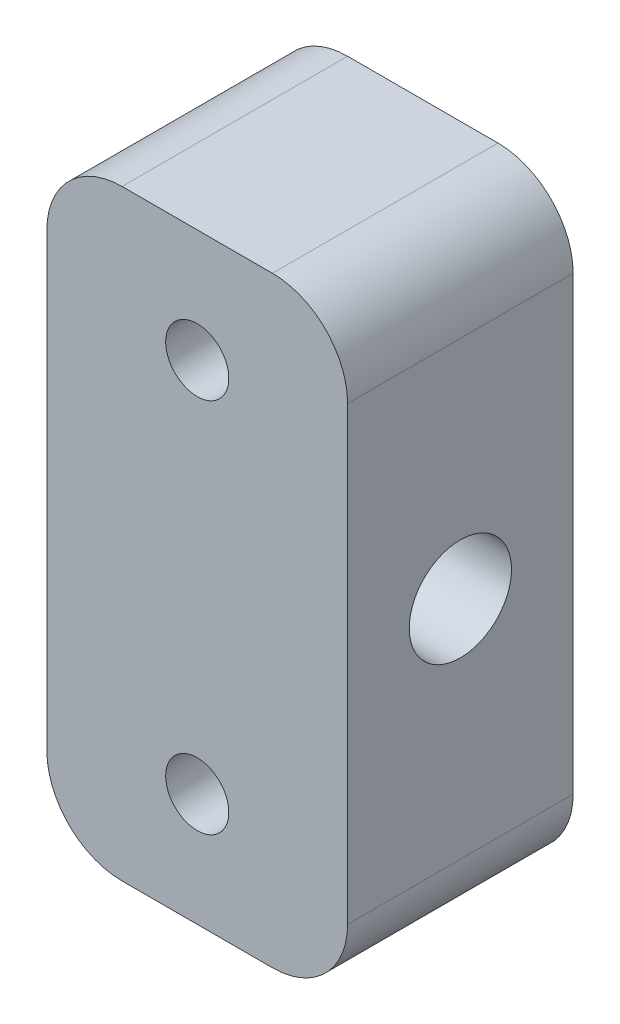
ISO-10303-21;
HEADER;
FILE_DESCRIPTION(('STEP AP214'),'2;1');
FILE_NAME('part.step','',(''),(''),'','','');
FILE_SCHEMA(('AUTOMOTIVE_DESIGN { 1 0 10303 214 1 1 1 1 }'));
ENDSEC;
DATA;
#1=APPLICATION_CONTEXT('core data for automotive mechanical design processes');
#2=APPLICATION_PROTOCOL_DEFINITION('international standard','automotive_design',2000,#1);
#3=PRODUCT_CONTEXT('',#1,'mechanical');
#4=PRODUCT('Part','Part','',(#3));
#5=PRODUCT_RELATED_PRODUCT_CATEGORY('part','',(#4));
#6=PRODUCT_DEFINITION_FORMATION('','',#4);
#7=PRODUCT_DEFINITION_CONTEXT('part definition',#1,'design');
#8=PRODUCT_DEFINITION('design','',#6,#7);
#9=PRODUCT_DEFINITION_SHAPE('','',#8);
#10=(LENGTH_UNIT() NAMED_UNIT(*) SI_UNIT(.MILLI.,.METRE.));
#11=(NAMED_UNIT(*) PLANE_ANGLE_UNIT() SI_UNIT($,.RADIAN.));
#12=(NAMED_UNIT(*) SI_UNIT($,.STERADIAN.) SOLID_ANGLE_UNIT());
#13=UNCERTAINTY_MEASURE_WITH_UNIT(LENGTH_MEASURE(1.E-05),#10,'distance_accuracy_value','');
#14=(GEOMETRIC_REPRESENTATION_CONTEXT(3) GLOBAL_UNCERTAINTY_ASSIGNED_CONTEXT((#13)) GLOBAL_UNIT_ASSIGNED_CONTEXT((#10,
#11,#12)) REPRESENTATION_CONTEXT('',''));
#15=CARTESIAN_POINT('',(0.,0.,0.));
#16=DIRECTION('',(0.,0.,1.));
#17=DIRECTION('',(1.,0.,0.));
#18=AXIS2_PLACEMENT_3D('',#15,#16,#17);
#19=CARTESIAN_POINT('',(10.,-20.,7.5));
#20=DIRECTION('',(-1.,0.,0.));
#21=DIRECTION('',(0.,0.,1.));
#22=AXIS2_PLACEMENT_3D('',#19,#20,#21);
#23=PLANE('',#22);
#24=CARTESIAN_POINT('',(10.,0.,0.));
#25=DIRECTION('',(-1.,0.,0.));
#26=DIRECTION('',(0.,0.,1.));
#27=AXIS2_PLACEMENT_3D('',#24,#25,#26);
#28=CIRCLE('',#27,3.4);
#29=CARTESIAN_POINT('',(10.,0.,3.4));
#30=VERTEX_POINT('',#29);
#31=EDGE_CURVE('E195',#30,#30,#28,.T.);
#32=ORIENTED_EDGE('',*,*,#31,.T.);
#33=EDGE_LOOP('',(#32));
#34=FACE_BOUND('',#33,.T.);
#35=DIRECTION('',(0.,1.,0.));
#36=VECTOR('',#35,1.);
#37=CARTESIAN_POINT('',(10.,-20.,7.5));
#38=LINE('',#37,#36);
#39=CARTESIAN_POINT('',(10.,-15.,7.5));
#40=VERTEX_POINT('',#39);
#41=CARTESIAN_POINT('',(10.,15.,7.5));
#42=VERTEX_POINT('',#41);
#43=EDGE_CURVE('E127',#40,#42,#38,.T.);
#44=ORIENTED_EDGE('',*,*,#43,.F.);
#45=DIRECTION('',(0.,0.,-1.));
#46=VECTOR('',#45,1.);
#47=CARTESIAN_POINT('',(10.,-15.,7.5));
#48=LINE('',#47,#46);
#49=CARTESIAN_POINT('',(10.,-15.,-7.5));
#50=VERTEX_POINT('',#49);
#51=EDGE_CURVE('E112',#40,#50,#48,.T.);
#52=ORIENTED_EDGE('',*,*,#51,.T.);
#53=DIRECTION('',(0.,1.,0.));
#54=VECTOR('',#53,1.);
#55=CARTESIAN_POINT('',(10.,-20.,-7.5));
#56=LINE('',#55,#54);
#57=CARTESIAN_POINT('',(10.,15.,-7.5));
#58=VERTEX_POINT('',#57);
#59=EDGE_CURVE('E124',#50,#58,#56,.T.);
#60=ORIENTED_EDGE('',*,*,#59,.T.);
#61=DIRECTION('',(0.,0.,-1.));
#62=VECTOR('',#61,1.);
#63=CARTESIAN_POINT('',(10.,15.,7.5));
#64=LINE('',#63,#62);
#65=EDGE_CURVE('E129',#58,#42,#64,.F.);
#66=ORIENTED_EDGE('',*,*,#65,.T.);
#67=EDGE_LOOP('',(#44,#52,#60,#66));
#68=FACE_BOUND('',#67,.T.);
#69=ADVANCED_FACE('F42',(#34,#68),#23,.F.);
#70=CARTESIAN_POINT('',(-10.,20.,7.5));
#71=DIRECTION('',(0.,-1.,0.));
#72=DIRECTION('',(0.,0.,-1.));
#73=AXIS2_PLACEMENT_3D('',#70,#71,#72);
#74=PLANE('',#73);
#75=DIRECTION('',(-1.,0.,0.));
#76=VECTOR('',#75,1.);
#77=CARTESIAN_POINT('',(-10.,20.,-7.5));
#78=LINE('',#77,#76);
#79=CARTESIAN_POINT('',(5.,20.,-7.5));
#80=VERTEX_POINT('',#79);
#81=CARTESIAN_POINT('',(-5.,20.,-7.5));
#82=VERTEX_POINT('',#81);
#83=EDGE_CURVE('E133',#80,#82,#78,.T.);
#84=ORIENTED_EDGE('',*,*,#83,.T.);
#85=DIRECTION('',(0.,0.,-1.));
#86=VECTOR('',#85,1.);
#87=CARTESIAN_POINT('',(-5.,20.,7.5));
#88=LINE('',#87,#86);
#89=CARTESIAN_POINT('',(-5.,20.,7.5));
#90=VERTEX_POINT('',#89);
#91=EDGE_CURVE('E11',#82,#90,#88,.F.);
#92=ORIENTED_EDGE('',*,*,#91,.T.);
#93=DIRECTION('',(-1.,0.,0.));
#94=VECTOR('',#93,1.);
#95=CARTESIAN_POINT('',(-10.,20.,7.5));
#96=LINE('',#95,#94);
#97=CARTESIAN_POINT('',(5.,20.,7.5));
#98=VERTEX_POINT('',#97);
#99=EDGE_CURVE('E173',#98,#90,#96,.T.);
#100=ORIENTED_EDGE('',*,*,#99,.F.);
#101=DIRECTION('',(0.,0.,-1.));
#102=VECTOR('',#101,1.);
#103=CARTESIAN_POINT('',(5.,20.,7.5));
#104=LINE('',#103,#102);
#105=EDGE_CURVE('E50',#98,#80,#104,.T.);
#106=ORIENTED_EDGE('',*,*,#105,.T.);
#107=EDGE_LOOP('',(#84,#92,#100,#106));
#108=FACE_BOUND('',#107,.T.);
#109=ADVANCED_FACE('F171',(#108),#74,.F.);
#110=CARTESIAN_POINT('',(-10.,-20.,7.5));
#111=DIRECTION('',(1.,0.,0.));
#112=DIRECTION('',(0.,0.,-1.));
#113=AXIS2_PLACEMENT_3D('',#110,#111,#112);
#114=PLANE('',#113);
#115=CARTESIAN_POINT('',(-10.,0.,0.));
#116=DIRECTION('',(-1.,0.,0.));
#117=DIRECTION('',(0.,0.,1.));
#118=AXIS2_PLACEMENT_3D('',#115,#116,#117);
#119=CIRCLE('',#118,3.39999999999999);
#120=CARTESIAN_POINT('',(-10.,0.,3.39999999999999));
#121=VERTEX_POINT('',#120);
#122=EDGE_CURVE('E198',#121,#121,#119,.T.);
#123=ORIENTED_EDGE('',*,*,#122,.F.);
#124=EDGE_LOOP('',(#123));
#125=FACE_BOUND('',#124,.T.);
#126=DIRECTION('',(0.,-1.,0.));
#127=VECTOR('',#126,1.);
#128=CARTESIAN_POINT('',(-10.,-20.,-7.5));
#129=LINE('',#128,#127);
#130=CARTESIAN_POINT('',(-10.,15.,-7.5));
#131=VERTEX_POINT('',#130);
#132=CARTESIAN_POINT('',(-10.,-15.,-7.5));
#133=VERTEX_POINT('',#132);
#134=EDGE_CURVE('E137',#131,#133,#129,.T.);
#135=ORIENTED_EDGE('',*,*,#134,.T.);
#136=DIRECTION('',(0.,0.,-1.));
#137=VECTOR('',#136,1.);
#138=CARTESIAN_POINT('',(-10.,-15.,7.5));
#139=LINE('',#138,#137);
#140=CARTESIAN_POINT('',(-10.,-15.,7.5));
#141=VERTEX_POINT('',#140);
#142=EDGE_CURVE('E57',#133,#141,#139,.F.);
#143=ORIENTED_EDGE('',*,*,#142,.T.);
#144=DIRECTION('',(0.,-1.,0.));
#145=VECTOR('',#144,1.);
#146=CARTESIAN_POINT('',(-10.,-20.,7.5));
#147=LINE('',#146,#145);
#148=CARTESIAN_POINT('',(-10.,15.,7.5));
#149=VERTEX_POINT('',#148);
#150=EDGE_CURVE('E181',#149,#141,#147,.T.);
#151=ORIENTED_EDGE('',*,*,#150,.F.);
#152=DIRECTION('',(0.,0.,-1.));
#153=VECTOR('',#152,1.);
#154=CARTESIAN_POINT('',(-10.,15.,7.5));
#155=LINE('',#154,#153);
#156=EDGE_CURVE('E164',#149,#131,#155,.T.);
#157=ORIENTED_EDGE('',*,*,#156,.T.);
#158=EDGE_LOOP('',(#135,#143,#151,#157));
#159=FACE_BOUND('',#158,.T.);
#160=ADVANCED_FACE('F180',(#125,#159),#114,.F.);
#161=CARTESIAN_POINT('',(-10.,-20.,7.5));
#162=DIRECTION('',(0.,1.,0.));
#163=DIRECTION('',(0.,0.,1.));
#164=AXIS2_PLACEMENT_3D('',#161,#162,#163);
#165=PLANE('',#164);
#166=DIRECTION('',(1.,0.,0.));
#167=VECTOR('',#166,1.);
#168=CARTESIAN_POINT('',(-10.,-20.,-7.5));
#169=LINE('',#168,#167);
#170=CARTESIAN_POINT('',(-5.,-20.,-7.5));
#171=VERTEX_POINT('',#170);
#172=CARTESIAN_POINT('',(5.,-20.,-7.5));
#173=VERTEX_POINT('',#172);
#174=EDGE_CURVE('E147',#171,#173,#169,.T.);
#175=ORIENTED_EDGE('',*,*,#174,.T.);
#176=DIRECTION('',(0.,0.,-1.));
#177=VECTOR('',#176,1.);
#178=CARTESIAN_POINT('',(5.,-20.,7.5));
#179=LINE('',#178,#177);
#180=CARTESIAN_POINT('',(5.,-20.,7.5));
#181=VERTEX_POINT('',#180);
#182=EDGE_CURVE('E113',#173,#181,#179,.F.);
#183=ORIENTED_EDGE('',*,*,#182,.T.);
#184=DIRECTION('',(1.,0.,0.));
#185=VECTOR('',#184,1.);
#186=CARTESIAN_POINT('',(-10.,-20.,7.5));
#187=LINE('',#186,#185);
#188=CARTESIAN_POINT('',(-5.,-20.,7.5));
#189=VERTEX_POINT('',#188);
#190=EDGE_CURVE('E143',#189,#181,#187,.T.);
#191=ORIENTED_EDGE('',*,*,#190,.F.);
#192=DIRECTION('',(0.,0.,-1.));
#193=VECTOR('',#192,1.);
#194=CARTESIAN_POINT('',(-5.,-20.,7.5));
#195=LINE('',#194,#193);
#196=EDGE_CURVE('E118',#189,#171,#195,.T.);
#197=ORIENTED_EDGE('',*,*,#196,.T.);
#198=EDGE_LOOP('',(#175,#183,#191,#197));
#199=FACE_BOUND('',#198,.T.);
#200=ADVANCED_FACE('F205',(#199),#165,.F.);
#201=CARTESIAN_POINT('',(0.,0.,7.5));
#202=DIRECTION('',(0.,0.,-1.));
#203=DIRECTION('',(-1.,0.,0.));
#204=AXIS2_PLACEMENT_3D('',#201,#202,#203);
#205=PLANE('',#204);
#206=CARTESIAN_POINT('',(0.,12.5,7.5));
#207=DIRECTION('',(0.,0.,-1.));
#208=DIRECTION('',(-1.,0.,0.));
#209=AXIS2_PLACEMENT_3D('',#206,#207,#208);
#210=CIRCLE('',#209,2.1);
#211=CARTESIAN_POINT('',(-2.09999999999999,12.5,7.5));
#212=VERTEX_POINT('',#211);
#213=EDGE_CURVE('E189',#212,#212,#210,.T.);
#214=ORIENTED_EDGE('',*,*,#213,.T.);
#215=EDGE_LOOP('',(#214));
#216=FACE_BOUND('',#215,.T.);
#217=CARTESIAN_POINT('',(0.,-12.5,7.5));
#218=DIRECTION('',(0.,0.,-1.));
#219=DIRECTION('',(-1.,0.,0.));
#220=AXIS2_PLACEMENT_3D('',#217,#218,#219);
#221=CIRCLE('',#220,2.1);
#222=CARTESIAN_POINT('',(-2.1,-12.5,7.5));
#223=VERTEX_POINT('',#222);
#224=EDGE_CURVE('E134',#223,#223,#221,.T.);
#225=ORIENTED_EDGE('',*,*,#224,.T.);
#226=EDGE_LOOP('',(#225));
#227=FACE_BOUND('',#226,.T.);
#228=ORIENTED_EDGE('',*,*,#190,.T.);
#229=CARTESIAN_POINT('',(5.,-15.,7.5));
#230=DIRECTION('',(0.,0.,-1.));
#231=DIRECTION('',(-1.,0.,0.));
#232=AXIS2_PLACEMENT_3D('',#229,#230,#231);
#233=CIRCLE('',#232,5.);
#234=EDGE_CURVE('E162',#181,#40,#233,.F.);
#235=ORIENTED_EDGE('',*,*,#234,.T.);
#236=ORIENTED_EDGE('',*,*,#43,.T.);
#237=CARTESIAN_POINT('',(5.,15.,7.5));
#238=DIRECTION('',(0.,0.,-1.));
#239=DIRECTION('',(-1.,0.,0.));
#240=AXIS2_PLACEMENT_3D('',#237,#238,#239);
#241=CIRCLE('',#240,5.);
#242=EDGE_CURVE('E157',#42,#98,#241,.F.);
#243=ORIENTED_EDGE('',*,*,#242,.T.);
#244=ORIENTED_EDGE('',*,*,#99,.T.);
#245=CARTESIAN_POINT('',(-5.,15.,7.5));
#246=DIRECTION('',(0.,0.,-1.));
#247=DIRECTION('',(-1.,0.,0.));
#248=AXIS2_PLACEMENT_3D('',#245,#246,#247);
#249=CIRCLE('',#248,5.);
#250=EDGE_CURVE('E64',#90,#149,#249,.F.);
#251=ORIENTED_EDGE('',*,*,#250,.T.);
#252=ORIENTED_EDGE('',*,*,#150,.T.);
#253=CARTESIAN_POINT('',(-5.,-15.,7.5));
#254=DIRECTION('',(0.,0.,-1.));
#255=DIRECTION('',(-1.,0.,0.));
#256=AXIS2_PLACEMENT_3D('',#253,#254,#255);
#257=CIRCLE('',#256,5.);
#258=EDGE_CURVE('E160',#141,#189,#257,.F.);
#259=ORIENTED_EDGE('',*,*,#258,.T.);
#260=EDGE_LOOP('',(#228,#235,#236,#243,#244,#251,#252,#259));
#261=FACE_BOUND('',#260,.T.);
#262=ADVANCED_FACE('F211',(#216,#227,#261),#205,.F.);
#263=CARTESIAN_POINT('',(0.,0.,-7.5));
#264=DIRECTION('',(0.,0.,-1.));
#265=DIRECTION('',(-1.,0.,0.));
#266=AXIS2_PLACEMENT_3D('',#263,#264,#265);
#267=PLANE('',#266);
#268=CARTESIAN_POINT('',(0.,12.5,-7.5));
#269=DIRECTION('',(0.,0.,-1.));
#270=DIRECTION('',(-1.,0.,0.));
#271=AXIS2_PLACEMENT_3D('',#268,#269,#270);
#272=CIRCLE('',#271,2.1);
#273=CARTESIAN_POINT('',(-2.09999999999999,12.5,-7.5));
#274=VERTEX_POINT('',#273);
#275=EDGE_CURVE('E192',#274,#274,#272,.T.);
#276=ORIENTED_EDGE('',*,*,#275,.F.);
#277=EDGE_LOOP('',(#276));
#278=FACE_BOUND('',#277,.T.);
#279=CARTESIAN_POINT('',(0.,-12.5,-7.5));
#280=DIRECTION('',(0.,0.,-1.));
#281=DIRECTION('',(-1.,0.,0.));
#282=AXIS2_PLACEMENT_3D('',#279,#280,#281);
#283=CIRCLE('',#282,2.1);
#284=CARTESIAN_POINT('',(-2.1,-12.5,-7.5));
#285=VERTEX_POINT('',#284);
#286=EDGE_CURVE('E140',#285,#285,#283,.T.);
#287=ORIENTED_EDGE('',*,*,#286,.F.);
#288=EDGE_LOOP('',(#287));
#289=FACE_BOUND('',#288,.T.);
#290=ORIENTED_EDGE('',*,*,#59,.F.);
#291=CARTESIAN_POINT('',(5.,-15.,-7.5));
#292=DIRECTION('',(0.,0.,-1.));
#293=DIRECTION('',(-1.,0.,0.));
#294=AXIS2_PLACEMENT_3D('',#291,#292,#293);
#295=CIRCLE('',#294,5.);
#296=EDGE_CURVE('E108',#50,#173,#295,.T.);
#297=ORIENTED_EDGE('',*,*,#296,.T.);
#298=ORIENTED_EDGE('',*,*,#174,.F.);
#299=CARTESIAN_POINT('',(-5.,-15.,-7.5));
#300=DIRECTION('',(0.,0.,-1.));
#301=DIRECTION('',(-1.,0.,0.));
#302=AXIS2_PLACEMENT_3D('',#299,#300,#301);
#303=CIRCLE('',#302,5.);
#304=EDGE_CURVE('E119',#171,#133,#303,.T.);
#305=ORIENTED_EDGE('',*,*,#304,.T.);
#306=ORIENTED_EDGE('',*,*,#134,.F.);
#307=CARTESIAN_POINT('',(-5.,15.,-7.5));
#308=DIRECTION('',(0.,0.,-1.));
#309=DIRECTION('',(-1.,0.,0.));
#310=AXIS2_PLACEMENT_3D('',#307,#308,#309);
#311=CIRCLE('',#310,5.);
#312=EDGE_CURVE('E151',#131,#82,#311,.T.);
#313=ORIENTED_EDGE('',*,*,#312,.T.);
#314=ORIENTED_EDGE('',*,*,#83,.F.);
#315=CARTESIAN_POINT('',(5.,15.,-7.5));
#316=DIRECTION('',(0.,0.,-1.));
#317=DIRECTION('',(-1.,0.,0.));
#318=AXIS2_PLACEMENT_3D('',#315,#316,#317);
#319=CIRCLE('',#318,5.);
#320=EDGE_CURVE('E128',#80,#58,#319,.T.);
#321=ORIENTED_EDGE('',*,*,#320,.T.);
#322=EDGE_LOOP('',(#290,#297,#298,#305,#306,#313,#314,#321));
#323=FACE_BOUND('',#322,.T.);
#324=ADVANCED_FACE('F131',(#278,#289,#323),#267,.T.);
#325=CARTESIAN_POINT('',(5.,-15.,7.5));
#326=DIRECTION('',(0.,0.,-1.));
#327=DIRECTION('',(-1.,0.,0.));
#328=AXIS2_PLACEMENT_3D('',#325,#326,#327);
#329=CYLINDRICAL_SURFACE('',#328,5.);
#330=ORIENTED_EDGE('',*,*,#234,.F.);
#331=ORIENTED_EDGE('',*,*,#182,.F.);
#332=ORIENTED_EDGE('',*,*,#296,.F.);
#333=ORIENTED_EDGE('',*,*,#51,.F.);
#334=EDGE_LOOP('',(#330,#331,#332,#333));
#335=FACE_BOUND('',#334,.T.);
#336=ADVANCED_FACE('F111',(#335),#329,.T.);
#337=CARTESIAN_POINT('',(-5.,-15.,7.5));
#338=DIRECTION('',(0.,0.,-1.));
#339=DIRECTION('',(-1.,0.,0.));
#340=AXIS2_PLACEMENT_3D('',#337,#338,#339);
#341=CYLINDRICAL_SURFACE('',#340,5.);
#342=ORIENTED_EDGE('',*,*,#258,.F.);
#343=ORIENTED_EDGE('',*,*,#142,.F.);
#344=ORIENTED_EDGE('',*,*,#304,.F.);
#345=ORIENTED_EDGE('',*,*,#196,.F.);
#346=EDGE_LOOP('',(#342,#343,#344,#345));
#347=FACE_BOUND('',#346,.T.);
#348=ADVANCED_FACE('F223',(#347),#341,.T.);
#349=CARTESIAN_POINT('',(-5.,15.,7.5));
#350=DIRECTION('',(0.,0.,-1.));
#351=DIRECTION('',(-1.,0.,0.));
#352=AXIS2_PLACEMENT_3D('',#349,#350,#351);
#353=CYLINDRICAL_SURFACE('',#352,5.);
#354=ORIENTED_EDGE('',*,*,#250,.F.);
#355=ORIENTED_EDGE('',*,*,#91,.F.);
#356=ORIENTED_EDGE('',*,*,#312,.F.);
#357=ORIENTED_EDGE('',*,*,#156,.F.);
#358=EDGE_LOOP('',(#354,#355,#356,#357));
#359=FACE_BOUND('',#358,.T.);
#360=ADVANCED_FACE('F179',(#359),#353,.T.);
#361=CARTESIAN_POINT('',(5.,15.,7.5));
#362=DIRECTION('',(0.,0.,-1.));
#363=DIRECTION('',(-1.,0.,0.));
#364=AXIS2_PLACEMENT_3D('',#361,#362,#363);
#365=CYLINDRICAL_SURFACE('',#364,5.);
#366=ORIENTED_EDGE('',*,*,#242,.F.);
#367=ORIENTED_EDGE('',*,*,#65,.F.);
#368=ORIENTED_EDGE('',*,*,#320,.F.);
#369=ORIENTED_EDGE('',*,*,#105,.F.);
#370=EDGE_LOOP('',(#366,#367,#368,#369));
#371=FACE_BOUND('',#370,.T.);
#372=ADVANCED_FACE('F44',(#371),#365,.T.);
#373=CARTESIAN_POINT('',(0.,-12.5,-7.5));
#374=DIRECTION('',(0.,0.,-1.));
#375=DIRECTION('',(-1.,0.,0.));
#376=AXIS2_PLACEMENT_3D('',#373,#374,#375);
#377=CYLINDRICAL_SURFACE('',#376,2.1);
#378=ORIENTED_EDGE('',*,*,#224,.F.);
#379=EDGE_LOOP('',(#378));
#380=FACE_BOUND('',#379,.T.);
#381=ORIENTED_EDGE('',*,*,#286,.T.);
#382=EDGE_LOOP('',(#381));
#383=FACE_BOUND('',#382,.T.);
#384=ADVANCED_FACE('F230',(#380,#383),#377,.F.);
#385=CARTESIAN_POINT('',(0.,12.5,-7.5));
#386=DIRECTION('',(0.,0.,-1.));
#387=DIRECTION('',(-1.,0.,0.));
#388=AXIS2_PLACEMENT_3D('',#385,#386,#387);
#389=CYLINDRICAL_SURFACE('',#388,2.1);
#390=ORIENTED_EDGE('',*,*,#213,.F.);
#391=EDGE_LOOP('',(#390));
#392=FACE_BOUND('',#391,.T.);
#393=ORIENTED_EDGE('',*,*,#275,.T.);
#394=EDGE_LOOP('',(#393));
#395=FACE_BOUND('',#394,.T.);
#396=ADVANCED_FACE('F234',(#392,#395),#389,.F.);
#397=CARTESIAN_POINT('',(-10.,0.,0.));
#398=DIRECTION('',(-1.,0.,0.));
#399=DIRECTION('',(0.,0.,1.));
#400=AXIS2_PLACEMENT_3D('',#397,#398,#399);
#401=CYLINDRICAL_SURFACE('',#400,3.39999999999999);
#402=ORIENTED_EDGE('',*,*,#31,.F.);
#403=EDGE_LOOP('',(#402));
#404=FACE_BOUND('',#403,.T.);
#405=ORIENTED_EDGE('',*,*,#122,.T.);
#406=EDGE_LOOP('',(#405));
#407=FACE_BOUND('',#406,.T.);
#408=ADVANCED_FACE('F202',(#404,#407),#401,.F.);
#409=CLOSED_SHELL('',(#69,#109,#160,#200,#262,#324,#336,#348,#360,#372,#384,#396,#408));
#410=MANIFOLD_SOLID_BREP('B2',#409);
#411=ADVANCED_BREP_SHAPE_REPRESENTATION('',(#18,#410),#14);
#412=SHAPE_DEFINITION_REPRESENTATION(#9,#411);
ENDSEC;
END-ISO-10303-21;
